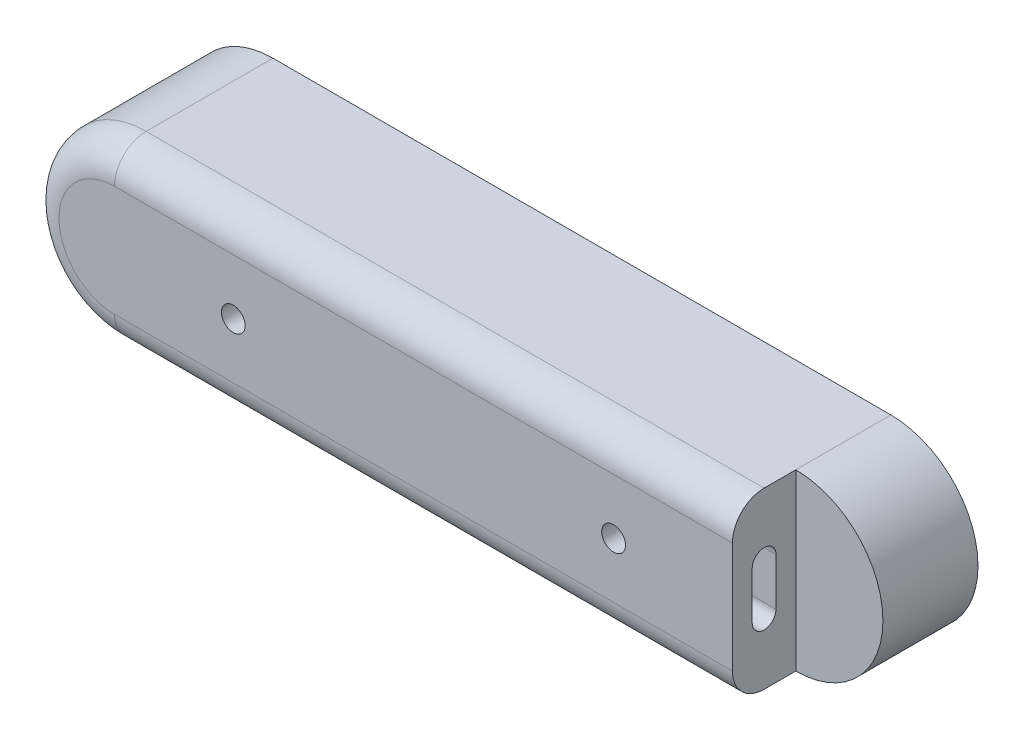
ISO-10303-21;
HEADER;
FILE_DESCRIPTION(('STEP AP214'),'2;1');
FILE_NAME('part.step','',(''),(''),'','','');
FILE_SCHEMA(('AUTOMOTIVE_DESIGN { 1 0 10303 214 1 1 1 1 }'));
ENDSEC;
DATA;
#1=APPLICATION_CONTEXT('core data for automotive mechanical design processes');
#2=APPLICATION_PROTOCOL_DEFINITION('international standard','automotive_design',2000,#1);
#3=PRODUCT_CONTEXT('',#1,'mechanical');
#4=PRODUCT('Part','Part','',(#3));
#5=PRODUCT_RELATED_PRODUCT_CATEGORY('part','',(#4));
#6=PRODUCT_DEFINITION_FORMATION('','',#4);
#7=PRODUCT_DEFINITION_CONTEXT('part definition',#1,'design');
#8=PRODUCT_DEFINITION('design','',#6,#7);
#9=PRODUCT_DEFINITION_SHAPE('','',#8);
#10=(LENGTH_UNIT() NAMED_UNIT(*) SI_UNIT(.MILLI.,.METRE.));
#11=(NAMED_UNIT(*) PLANE_ANGLE_UNIT() SI_UNIT($,.RADIAN.));
#12=(NAMED_UNIT(*) SI_UNIT($,.STERADIAN.) SOLID_ANGLE_UNIT());
#13=UNCERTAINTY_MEASURE_WITH_UNIT(LENGTH_MEASURE(1.E-05),#10,'distance_accuracy_value','');
#14=(GEOMETRIC_REPRESENTATION_CONTEXT(3) GLOBAL_UNCERTAINTY_ASSIGNED_CONTEXT((#13)) GLOBAL_UNIT_ASSIGNED_CONTEXT((#10,
#11,#12)) REPRESENTATION_CONTEXT('',''));
#15=CARTESIAN_POINT('',(0.,0.,0.));
#16=DIRECTION('',(0.,0.,1.));
#17=DIRECTION('',(1.,0.,0.));
#18=AXIS2_PLACEMENT_3D('',#15,#16,#17);
#19=CARTESIAN_POINT('',(0.,0.,20.));
#20=DIRECTION('',(0.,0.,1.));
#21=DIRECTION('',(1.,0.,0.));
#22=AXIS2_PLACEMENT_3D('',#19,#20,#21);
#23=PLANE('',#22);
#24=CARTESIAN_POINT('',(24.,0.,20.));
#25=DIRECTION('',(0.,0.,-1.));
#26=DIRECTION('',(-1.,0.,0.));
#27=AXIS2_PLACEMENT_3D('',#24,#25,#26);
#28=CIRCLE('',#27,1.5);
#29=CARTESIAN_POINT('',(22.5,0.,20.));
#30=VERTEX_POINT('',#29);
#31=EDGE_CURVE('E221',#30,#30,#28,.T.);
#32=ORIENTED_EDGE('',*,*,#31,.T.);
#33=EDGE_LOOP('',(#32));
#34=FACE_BOUND('',#33,.T.);
#35=CARTESIAN_POINT('',(-39.,0.,20.));
#36=DIRECTION('',(0.,0.,1.));
#37=DIRECTION('',(1.,0.,0.));
#38=AXIS2_PLACEMENT_3D('',#35,#36,#37);
#39=CIRCLE('',#38,7.);
#40=CARTESIAN_POINT('',(-39.,7.,20.));
#41=VERTEX_POINT('',#40);
#42=CARTESIAN_POINT('',(-39.,-7.,20.));
#43=VERTEX_POINT('',#42);
#44=EDGE_CURVE('E197',#41,#43,#39,.T.);
#45=ORIENTED_EDGE('',*,*,#44,.T.);
#46=DIRECTION('',(1.,0.,0.));
#47=VECTOR('',#46,1.);
#48=CARTESIAN_POINT('',(39.,-7.,20.));
#49=LINE('',#48,#47);
#50=CARTESIAN_POINT('',(39.0000000000001,-7.,20.));
#51=VERTEX_POINT('',#50);
#52=EDGE_CURVE('E200',#43,#51,#49,.T.);
#53=ORIENTED_EDGE('',*,*,#52,.T.);
#54=DIRECTION('',(0.,-1.,0.));
#55=VECTOR('',#54,1.);
#56=CARTESIAN_POINT('',(39.,2.829176287184E-13,20.));
#57=LINE('',#56,#55);
#58=CARTESIAN_POINT('',(39.,7.,20.));
#59=VERTEX_POINT('',#58);
#60=EDGE_CURVE('E165',#59,#51,#57,.T.);
#61=ORIENTED_EDGE('',*,*,#60,.F.);
#62=DIRECTION('',(-1.,0.,0.));
#63=VECTOR('',#62,1.);
#64=CARTESIAN_POINT('',(-39.,7.,20.));
#65=LINE('',#64,#63);
#66=EDGE_CURVE('E195',#59,#41,#65,.T.);
#67=ORIENTED_EDGE('',*,*,#66,.T.);
#68=EDGE_LOOP('',(#45,#53,#61,#67));
#69=FACE_BOUND('',#68,.T.);
#70=CARTESIAN_POINT('',(-24.,0.,20.));
#71=DIRECTION('',(0.,0.,1.));
#72=DIRECTION('',(1.,0.,0.));
#73=AXIS2_PLACEMENT_3D('',#70,#71,#72);
#74=CIRCLE('',#73,1.5);
#75=CARTESIAN_POINT('',(-22.5,0.,20.));
#76=VERTEX_POINT('',#75);
#77=EDGE_CURVE('E216',#76,#76,#74,.T.);
#78=ORIENTED_EDGE('',*,*,#77,.F.);
#79=EDGE_LOOP('',(#78));
#80=FACE_BOUND('',#79,.T.);
#81=ADVANCED_FACE('F42',(#34,#69,#80),#23,.T.);
#82=CARTESIAN_POINT('',(32.,2.4990531529678E-13,0.));
#83=DIRECTION('',(1.,0.,0.));
#84=DIRECTION('',(0.,1.,0.));
#85=AXIS2_PLACEMENT_3D('',#82,#83,#84);
#86=PLANE('',#85);
#87=DIRECTION('',(0.,-1.,0.));
#88=VECTOR('',#87,1.);
#89=CARTESIAN_POINT('',(32.,4.50000000000023,17.5));
#90=LINE('',#89,#88);
#91=CARTESIAN_POINT('',(32.,3.00000000000023,17.5));
#92=VERTEX_POINT('',#91);
#93=CARTESIAN_POINT('',(32.0000000000001,-2.99999999999977,17.5));
#94=VERTEX_POINT('',#93);
#95=EDGE_CURVE('E153',#92,#94,#90,.T.);
#96=ORIENTED_EDGE('',*,*,#95,.T.);
#97=CARTESIAN_POINT('',(32.0000000000001,-2.99999999999977,16.));
#98=DIRECTION('',(1.,0.,0.));
#99=DIRECTION('',(0.,1.,0.));
#100=AXIS2_PLACEMENT_3D('',#97,#98,#99);
#101=CIRCLE('',#100,1.5);
#102=CARTESIAN_POINT('',(32.0000000000001,-2.99999999999977,14.5));
#103=VERTEX_POINT('',#102);
#104=EDGE_CURVE('E137',#103,#94,#101,.F.);
#105=ORIENTED_EDGE('',*,*,#104,.F.);
#106=DIRECTION('',(0.,1.,0.));
#107=VECTOR('',#106,1.);
#108=CARTESIAN_POINT('',(32.,4.50000000000023,14.5));
#109=LINE('',#108,#107);
#110=CARTESIAN_POINT('',(32.,3.00000000000023,14.5));
#111=VERTEX_POINT('',#110);
#112=EDGE_CURVE('E145',#103,#111,#109,.T.);
#113=ORIENTED_EDGE('',*,*,#112,.T.);
#114=CARTESIAN_POINT('',(32.,3.00000000000023,16.));
#115=DIRECTION('',(1.,0.,0.));
#116=DIRECTION('',(0.,1.,0.));
#117=AXIS2_PLACEMENT_3D('',#114,#115,#116);
#118=CIRCLE('',#117,1.5);
#119=EDGE_CURVE('E236',#111,#92,#118,.T.);
#120=ORIENTED_EDGE('',*,*,#119,.T.);
#121=EDGE_LOOP('',(#96,#105,#113,#120));
#122=FACE_BOUND('',#121,.T.);
#123=ADVANCED_FACE('F242',(#122),#86,.T.);
#124=CARTESIAN_POINT('',(32.,4.50000000000023,14.5));
#125=DIRECTION('',(0.,0.,-1.));
#126=DIRECTION('',(-1.,0.,0.));
#127=AXIS2_PLACEMENT_3D('',#124,#125,#126);
#128=PLANE('',#127);
#129=DIRECTION('',(-1.,0.,0.));
#130=VECTOR('',#129,1.);
#131=CARTESIAN_POINT('',(39.0000000000001,-2.99999999999972,14.5));
#132=LINE('',#131,#130);
#133=CARTESIAN_POINT('',(39.0000000000001,-2.99999999999972,14.5));
#134=VERTEX_POINT('',#133);
#135=EDGE_CURVE('E129',#134,#103,#132,.T.);
#136=ORIENTED_EDGE('',*,*,#135,.F.);
#137=DIRECTION('',(0.,1.,0.));
#138=VECTOR('',#137,1.);
#139=CARTESIAN_POINT('',(39.,4.50000000000028,14.5));
#140=LINE('',#139,#138);
#141=CARTESIAN_POINT('',(39.,3.00000000000028,14.5));
#142=VERTEX_POINT('',#141);
#143=EDGE_CURVE('E143',#134,#142,#140,.T.);
#144=ORIENTED_EDGE('',*,*,#143,.T.);
#145=DIRECTION('',(-1.,0.,0.));
#146=VECTOR('',#145,1.);
#147=CARTESIAN_POINT('',(39.,3.00000000000028,14.5));
#148=LINE('',#147,#146);
#149=EDGE_CURVE('E146',#142,#111,#148,.T.);
#150=ORIENTED_EDGE('',*,*,#149,.T.);
#151=ORIENTED_EDGE('',*,*,#112,.F.);
#152=EDGE_LOOP('',(#136,#144,#150,#151));
#153=FACE_BOUND('',#152,.T.);
#154=ADVANCED_FACE('F141',(#153),#128,.F.);
#155=CARTESIAN_POINT('',(39.,0.,0.));
#156=DIRECTION('',(0.,0.,1.));
#157=DIRECTION('',(1.,0.,0.));
#158=AXIS2_PLACEMENT_3D('',#155,#156,#157);
#159=CYLINDRICAL_SURFACE('',#158,11.);
#160=CARTESIAN_POINT('',(39.,0.,12.));
#161=DIRECTION('',(0.,0.,1.));
#162=DIRECTION('',(1.,0.,0.));
#163=AXIS2_PLACEMENT_3D('',#160,#161,#162);
#164=CIRCLE('',#163,11.);
#165=CARTESIAN_POINT('',(39.,-11.,12.));
#166=VERTEX_POINT('',#165);
#167=CARTESIAN_POINT('',(39.,11.,12.));
#168=VERTEX_POINT('',#167);
#169=EDGE_CURVE('E162',#166,#168,#164,.T.);
#170=ORIENTED_EDGE('',*,*,#169,.F.);
#171=DIRECTION('',(0.,0.,1.));
#172=VECTOR('',#171,1.);
#173=CARTESIAN_POINT('',(39.,-11.,0.));
#174=LINE('',#173,#172);
#175=CARTESIAN_POINT('',(39.,-11.,0.));
#176=VERTEX_POINT('',#175);
#177=EDGE_CURVE('E173',#176,#166,#174,.T.);
#178=ORIENTED_EDGE('',*,*,#177,.F.);
#179=CARTESIAN_POINT('',(39.,0.,0.));
#180=DIRECTION('',(0.,0.,1.));
#181=DIRECTION('',(1.,0.,0.));
#182=AXIS2_PLACEMENT_3D('',#179,#180,#181);
#183=CIRCLE('',#182,11.);
#184=CARTESIAN_POINT('',(39.,11.,0.));
#185=VERTEX_POINT('',#184);
#186=EDGE_CURVE('E178',#185,#176,#183,.F.);
#187=ORIENTED_EDGE('',*,*,#186,.F.);
#188=DIRECTION('',(0.,0.,1.));
#189=VECTOR('',#188,1.);
#190=CARTESIAN_POINT('',(39.,11.,0.));
#191=LINE('',#190,#189);
#192=EDGE_CURVE('E184',#185,#168,#191,.T.);
#193=ORIENTED_EDGE('',*,*,#192,.T.);
#194=EDGE_LOOP('',(#170,#178,#187,#193));
#195=FACE_BOUND('',#194,.T.);
#196=ADVANCED_FACE('F269',(#195),#159,.T.);
#197=CARTESIAN_POINT('',(0.,0.,0.));
#198=DIRECTION('',(0.,0.,1.));
#199=DIRECTION('',(1.,0.,0.));
#200=AXIS2_PLACEMENT_3D('',#197,#198,#199);
#201=PLANE('',#200);
#202=DIRECTION('',(1.,0.,0.));
#203=VECTOR('',#202,1.);
#204=CARTESIAN_POINT('',(-50.,-11.,0.));
#205=LINE('',#204,#203);
#206=CARTESIAN_POINT('',(-39.,-11.,0.));
#207=VERTEX_POINT('',#206);
#208=EDGE_CURVE('E186',#207,#176,#205,.T.);
#209=ORIENTED_EDGE('',*,*,#208,.F.);
#210=CARTESIAN_POINT('',(-39.,0.,0.));
#211=DIRECTION('',(0.,0.,1.));
#212=DIRECTION('',(1.,0.,0.));
#213=AXIS2_PLACEMENT_3D('',#210,#211,#212);
#214=CIRCLE('',#213,11.);
#215=CARTESIAN_POINT('',(-39.,11.,0.));
#216=VERTEX_POINT('',#215);
#217=EDGE_CURVE('E181',#216,#207,#214,.T.);
#218=ORIENTED_EDGE('',*,*,#217,.F.);
#219=DIRECTION('',(-1.,0.,0.));
#220=VECTOR('',#219,1.);
#221=CARTESIAN_POINT('',(-50.,11.,0.));
#222=LINE('',#221,#220);
#223=EDGE_CURVE('E192',#185,#216,#222,.T.);
#224=ORIENTED_EDGE('',*,*,#223,.F.);
#225=ORIENTED_EDGE('',*,*,#186,.T.);
#226=EDGE_LOOP('',(#209,#218,#224,#225));
#227=FACE_BOUND('',#226,.T.);
#228=ADVANCED_FACE('F271',(#227),#201,.F.);
#229=CARTESIAN_POINT('',(-50.,-11.,20.));
#230=DIRECTION('',(0.,1.,0.));
#231=DIRECTION('',(0.,0.,1.));
#232=AXIS2_PLACEMENT_3D('',#229,#230,#231);
#233=PLANE('',#232);
#234=CARTESIAN_POINT('',(0.,-11.,8.00000000000489));
#235=DIRECTION('',(0.,-1.,0.));
#236=DIRECTION('',(0.,0.,-1.));
#237=AXIS2_PLACEMENT_3D('',#234,#235,#236);
#238=CIRCLE('',#237,4.);
#239=CARTESIAN_POINT('',(0.,-11.,4.00000000000489));
#240=VERTEX_POINT('',#239);
#241=EDGE_CURVE('E224',#240,#240,#238,.T.);
#242=ORIENTED_EDGE('',*,*,#241,.F.);
#243=EDGE_LOOP('',(#242));
#244=FACE_BOUND('',#243,.T.);
#245=DIRECTION('',(0.,0.,1.));
#246=VECTOR('',#245,1.);
#247=CARTESIAN_POINT('',(39.,-11.,12.));
#248=LINE('',#247,#246);
#249=CARTESIAN_POINT('',(39.,-11.,16.));
#250=VERTEX_POINT('',#249);
#251=EDGE_CURVE('E170',#166,#250,#248,.T.);
#252=ORIENTED_EDGE('',*,*,#251,.T.);
#253=DIRECTION('',(1.,0.,0.));
#254=VECTOR('',#253,1.);
#255=CARTESIAN_POINT('',(-39.,-11.,16.));
#256=LINE('',#255,#254);
#257=CARTESIAN_POINT('',(-39.,-11.,16.));
#258=VERTEX_POINT('',#257);
#259=EDGE_CURVE('E51',#250,#258,#256,.F.);
#260=ORIENTED_EDGE('',*,*,#259,.T.);
#261=DIRECTION('',(0.,0.,1.));
#262=VECTOR('',#261,1.);
#263=CARTESIAN_POINT('',(-39.,-11.,0.));
#264=LINE('',#263,#262);
#265=EDGE_CURVE('E175',#207,#258,#264,.T.);
#266=ORIENTED_EDGE('',*,*,#265,.F.);
#267=ORIENTED_EDGE('',*,*,#208,.T.);
#268=ORIENTED_EDGE('',*,*,#177,.T.);
#269=EDGE_LOOP('',(#252,#260,#266,#267,#268));
#270=FACE_BOUND('',#269,.T.);
#271=ADVANCED_FACE('F274',(#244,#270),#233,.F.);
#272=CARTESIAN_POINT('',(-50.,11.,20.));
#273=DIRECTION('',(0.,-1.,0.));
#274=DIRECTION('',(0.,0.,-1.));
#275=AXIS2_PLACEMENT_3D('',#272,#273,#274);
#276=PLANE('',#275);
#277=DIRECTION('',(0.,0.,1.));
#278=VECTOR('',#277,1.);
#279=CARTESIAN_POINT('',(-39.,11.,0.));
#280=LINE('',#279,#278);
#281=CARTESIAN_POINT('',(-39.,11.,16.));
#282=VERTEX_POINT('',#281);
#283=EDGE_CURVE('E183',#216,#282,#280,.T.);
#284=ORIENTED_EDGE('',*,*,#283,.T.);
#285=DIRECTION('',(-1.,0.,0.));
#286=VECTOR('',#285,1.);
#287=CARTESIAN_POINT('',(39.,11.,16.));
#288=LINE('',#287,#286);
#289=CARTESIAN_POINT('',(39.,11.,16.));
#290=VERTEX_POINT('',#289);
#291=EDGE_CURVE('E11',#282,#290,#288,.F.);
#292=ORIENTED_EDGE('',*,*,#291,.T.);
#293=DIRECTION('',(0.,0.,1.));
#294=VECTOR('',#293,1.);
#295=CARTESIAN_POINT('',(39.,11.,12.));
#296=LINE('',#295,#294);
#297=EDGE_CURVE('E167',#168,#290,#296,.T.);
#298=ORIENTED_EDGE('',*,*,#297,.F.);
#299=ORIENTED_EDGE('',*,*,#192,.F.);
#300=ORIENTED_EDGE('',*,*,#223,.T.);
#301=EDGE_LOOP('',(#284,#292,#298,#299,#300));
#302=FACE_BOUND('',#301,.T.);
#303=ADVANCED_FACE('F276',(#302),#276,.F.);
#304=CARTESIAN_POINT('',(-39.,0.,0.));
#305=DIRECTION('',(0.,0.,1.));
#306=DIRECTION('',(1.,0.,0.));
#307=AXIS2_PLACEMENT_3D('',#304,#305,#306);
#308=CYLINDRICAL_SURFACE('',#307,11.);
#309=ORIENTED_EDGE('',*,*,#265,.T.);
#310=CARTESIAN_POINT('',(-39.,0.,16.));
#311=DIRECTION('',(0.,0.,1.));
#312=DIRECTION('',(1.,0.,0.));
#313=AXIS2_PLACEMENT_3D('',#310,#311,#312);
#314=CIRCLE('',#313,11.);
#315=EDGE_CURVE('E202',#258,#282,#314,.F.);
#316=ORIENTED_EDGE('',*,*,#315,.T.);
#317=ORIENTED_EDGE('',*,*,#283,.F.);
#318=ORIENTED_EDGE('',*,*,#217,.T.);
#319=EDGE_LOOP('',(#309,#316,#317,#318));
#320=FACE_BOUND('',#319,.T.);
#321=ADVANCED_FACE('F279',(#320),#308,.T.);
#322=CARTESIAN_POINT('',(39.,2.829176287184E-13,12.));
#323=DIRECTION('',(-1.,0.,0.));
#324=DIRECTION('',(0.,-1.,0.));
#325=AXIS2_PLACEMENT_3D('',#322,#323,#324);
#326=PLANE('',#325);
#327=ORIENTED_EDGE('',*,*,#143,.F.);
#328=CARTESIAN_POINT('',(39.0000000000001,-2.99999999999972,16.));
#329=DIRECTION('',(1.,0.,0.));
#330=DIRECTION('',(0.,1.,0.));
#331=AXIS2_PLACEMENT_3D('',#328,#329,#330);
#332=CIRCLE('',#331,1.5);
#333=CARTESIAN_POINT('',(39.0000000000001,-2.99999999999972,17.5));
#334=VERTEX_POINT('',#333);
#335=EDGE_CURVE('E126',#134,#334,#332,.F.);
#336=ORIENTED_EDGE('',*,*,#335,.T.);
#337=DIRECTION('',(0.,-1.,0.));
#338=VECTOR('',#337,1.);
#339=CARTESIAN_POINT('',(39.,4.50000000000028,17.5));
#340=LINE('',#339,#338);
#341=CARTESIAN_POINT('',(39.,3.00000000000028,17.5));
#342=VERTEX_POINT('',#341);
#343=EDGE_CURVE('E154',#342,#334,#340,.T.);
#344=ORIENTED_EDGE('',*,*,#343,.F.);
#345=CARTESIAN_POINT('',(39.,3.00000000000028,16.));
#346=DIRECTION('',(1.,0.,0.));
#347=DIRECTION('',(0.,1.,0.));
#348=AXIS2_PLACEMENT_3D('',#345,#346,#347);
#349=CIRCLE('',#348,1.5);
#350=EDGE_CURVE('E151',#142,#342,#349,.T.);
#351=ORIENTED_EDGE('',*,*,#350,.F.);
#352=EDGE_LOOP('',(#327,#336,#344,#351));
#353=FACE_BOUND('',#352,.T.);
#354=ORIENTED_EDGE('',*,*,#60,.T.);
#355=CARTESIAN_POINT('',(39.0000000000001,-7.,16.));
#356=DIRECTION('',(-1.,0.,0.));
#357=DIRECTION('',(0.,-1.,0.));
#358=AXIS2_PLACEMENT_3D('',#355,#356,#357);
#359=CIRCLE('',#358,4.);
#360=EDGE_CURVE('E206',#51,#250,#359,.F.);
#361=ORIENTED_EDGE('',*,*,#360,.T.);
#362=ORIENTED_EDGE('',*,*,#251,.F.);
#363=DIRECTION('',(0.,-1.,0.));
#364=VECTOR('',#363,1.);
#365=CARTESIAN_POINT('',(39.,2.829176287184E-13,12.));
#366=LINE('',#365,#364);
#367=EDGE_CURVE('E164',#168,#166,#366,.T.);
#368=ORIENTED_EDGE('',*,*,#367,.F.);
#369=ORIENTED_EDGE('',*,*,#297,.T.);
#370=CARTESIAN_POINT('',(39.,7.,16.));
#371=DIRECTION('',(-1.,0.,0.));
#372=DIRECTION('',(0.,-1.,0.));
#373=AXIS2_PLACEMENT_3D('',#370,#371,#372);
#374=CIRCLE('',#373,4.);
#375=EDGE_CURVE('E204',#290,#59,#374,.F.);
#376=ORIENTED_EDGE('',*,*,#375,.T.);
#377=EDGE_LOOP('',(#354,#361,#362,#368,#369,#376));
#378=FACE_BOUND('',#377,.T.);
#379=ADVANCED_FACE('F148',(#353,#378),#326,.F.);
#380=CARTESIAN_POINT('',(0.,0.,12.));
#381=DIRECTION('',(0.,0.,1.));
#382=DIRECTION('',(1.,0.,0.));
#383=AXIS2_PLACEMENT_3D('',#380,#381,#382);
#384=PLANE('',#383);
#385=ORIENTED_EDGE('',*,*,#169,.T.);
#386=ORIENTED_EDGE('',*,*,#367,.T.);
#387=EDGE_LOOP('',(#385,#386));
#388=FACE_BOUND('',#387,.T.);
#389=ADVANCED_FACE('F249',(#388),#384,.T.);
#390=CARTESIAN_POINT('',(32.,4.50000000000023,17.5));
#391=DIRECTION('',(0.,0.,1.));
#392=DIRECTION('',(1.,0.,0.));
#393=AXIS2_PLACEMENT_3D('',#390,#391,#392);
#394=PLANE('',#393);
#395=ORIENTED_EDGE('',*,*,#343,.T.);
#396=DIRECTION('',(-1.,0.,0.));
#397=VECTOR('',#396,1.);
#398=CARTESIAN_POINT('',(39.0000000000001,-2.99999999999972,17.5));
#399=LINE('',#398,#397);
#400=EDGE_CURVE('E132',#334,#94,#399,.T.);
#401=ORIENTED_EDGE('',*,*,#400,.T.);
#402=ORIENTED_EDGE('',*,*,#95,.F.);
#403=DIRECTION('',(-1.,0.,0.));
#404=VECTOR('',#403,1.);
#405=CARTESIAN_POINT('',(39.,3.00000000000028,17.5));
#406=LINE('',#405,#404);
#407=EDGE_CURVE('E158',#342,#92,#406,.T.);
#408=ORIENTED_EDGE('',*,*,#407,.F.);
#409=EDGE_LOOP('',(#395,#401,#402,#408));
#410=FACE_BOUND('',#409,.T.);
#411=ADVANCED_FACE('F247',(#410),#394,.F.);
#412=CARTESIAN_POINT('',(39.,3.00000000000028,16.));
#413=DIRECTION('',(-1.,0.,0.));
#414=DIRECTION('',(0.,-1.,0.));
#415=AXIS2_PLACEMENT_3D('',#412,#413,#414);
#416=CYLINDRICAL_SURFACE('',#415,1.5);
#417=ORIENTED_EDGE('',*,*,#119,.F.);
#418=ORIENTED_EDGE('',*,*,#149,.F.);
#419=ORIENTED_EDGE('',*,*,#350,.T.);
#420=ORIENTED_EDGE('',*,*,#407,.T.);
#421=EDGE_LOOP('',(#417,#418,#419,#420));
#422=FACE_BOUND('',#421,.T.);
#423=ADVANCED_FACE('F245',(#422),#416,.F.);
#424=CARTESIAN_POINT('',(39.0000000000001,-2.99999999999972,16.));
#425=DIRECTION('',(-1.,0.,0.));
#426=DIRECTION('',(0.,-1.,0.));
#427=AXIS2_PLACEMENT_3D('',#424,#425,#426);
#428=CYLINDRICAL_SURFACE('',#427,1.5);
#429=ORIENTED_EDGE('',*,*,#104,.T.);
#430=ORIENTED_EDGE('',*,*,#400,.F.);
#431=ORIENTED_EDGE('',*,*,#335,.F.);
#432=ORIENTED_EDGE('',*,*,#135,.T.);
#433=EDGE_LOOP('',(#429,#430,#431,#432));
#434=FACE_BOUND('',#433,.T.);
#435=ADVANCED_FACE('F128',(#434),#428,.F.);
#436=CARTESIAN_POINT('',(0.,7.,16.));
#437=DIRECTION('',(1.,0.,0.));
#438=DIRECTION('',(0.,0.,-1.));
#439=AXIS2_PLACEMENT_3D('',#436,#437,#438);
#440=CYLINDRICAL_SURFACE('',#439,4.);
#441=ORIENTED_EDGE('',*,*,#375,.F.);
#442=ORIENTED_EDGE('',*,*,#291,.F.);
#443=CARTESIAN_POINT('',(-39.,7.,16.));
#444=DIRECTION('',(-1.,0.,0.));
#445=DIRECTION('',(0.,0.,1.));
#446=AXIS2_PLACEMENT_3D('',#443,#444,#445);
#447=CIRCLE('',#446,4.);
#448=EDGE_CURVE('E46',#41,#282,#447,.T.);
#449=ORIENTED_EDGE('',*,*,#448,.F.);
#450=ORIENTED_EDGE('',*,*,#66,.F.);
#451=EDGE_LOOP('',(#441,#442,#449,#450));
#452=FACE_BOUND('',#451,.T.);
#453=ADVANCED_FACE('F44',(#452),#440,.T.);
#454=CARTESIAN_POINT('',(0.,-7.,16.));
#455=DIRECTION('',(-1.,0.,0.));
#456=DIRECTION('',(0.,0.,1.));
#457=AXIS2_PLACEMENT_3D('',#454,#455,#456);
#458=CYLINDRICAL_SURFACE('',#457,4.);
#459=ORIENTED_EDGE('',*,*,#360,.F.);
#460=ORIENTED_EDGE('',*,*,#52,.F.);
#461=CARTESIAN_POINT('',(-39.,-7.,16.));
#462=DIRECTION('',(-1.,0.,0.));
#463=DIRECTION('',(0.,0.,1.));
#464=AXIS2_PLACEMENT_3D('',#461,#462,#463);
#465=CIRCLE('',#464,4.);
#466=EDGE_CURVE('E208',#258,#43,#465,.T.);
#467=ORIENTED_EDGE('',*,*,#466,.F.);
#468=ORIENTED_EDGE('',*,*,#259,.F.);
#469=EDGE_LOOP('',(#459,#460,#467,#468));
#470=FACE_BOUND('',#469,.T.);
#471=ADVANCED_FACE('F286',(#470),#458,.T.);
#472=CARTESIAN_POINT('',(-39.,0.,16.));
#473=DIRECTION('',(0.,0.,1.));
#474=DIRECTION('',(1.,0.,0.));
#475=AXIS2_PLACEMENT_3D('',#472,#473,#474);
#476=TOROIDAL_SURFACE('',#475,7.,4.);
#477=ORIENTED_EDGE('',*,*,#448,.T.);
#478=ORIENTED_EDGE('',*,*,#315,.F.);
#479=ORIENTED_EDGE('',*,*,#466,.T.);
#480=ORIENTED_EDGE('',*,*,#44,.F.);
#481=EDGE_LOOP('',(#477,#478,#479,#480));
#482=FACE_BOUND('',#481,.T.);
#483=ADVANCED_FACE('F283',(#482),#476,.T.);
#484=CARTESIAN_POINT('',(24.,0.,15.));
#485=DIRECTION('',(0.,0.,1.));
#486=DIRECTION('',(1.,0.,0.));
#487=AXIS2_PLACEMENT_3D('',#484,#485,#486);
#488=CYLINDRICAL_SURFACE('',#487,1.5);
#489=CARTESIAN_POINT('',(24.,0.,15.));
#490=DIRECTION('',(0.,0.,-1.));
#491=DIRECTION('',(-1.,0.,0.));
#492=AXIS2_PLACEMENT_3D('',#489,#490,#491);
#493=CIRCLE('',#492,1.5);
#494=CARTESIAN_POINT('',(22.5,0.,15.));
#495=VERTEX_POINT('',#494);
#496=EDGE_CURVE('E229',#495,#495,#493,.T.);
#497=ORIENTED_EDGE('',*,*,#496,.T.);
#498=EDGE_LOOP('',(#497));
#499=FACE_BOUND('',#498,.T.);
#500=ORIENTED_EDGE('',*,*,#31,.F.);
#501=EDGE_LOOP('',(#500));
#502=FACE_BOUND('',#501,.T.);
#503=ADVANCED_FACE('F285',(#499,#502),#488,.F.);
#504=CARTESIAN_POINT('',(24.,0.,15.));
#505=DIRECTION('',(0.,0.,-1.));
#506=DIRECTION('',(-1.,0.,0.));
#507=AXIS2_PLACEMENT_3D('',#504,#505,#506);
#508=PLANE('',#507);
#509=ORIENTED_EDGE('',*,*,#496,.F.);
#510=EDGE_LOOP('',(#509));
#511=FACE_BOUND('',#510,.T.);
#512=ADVANCED_FACE('F314',(#511),#508,.F.);
#513=CARTESIAN_POINT('',(-24.,0.,15.));
#514=DIRECTION('',(0.,0.,1.));
#515=DIRECTION('',(1.,0.,0.));
#516=AXIS2_PLACEMENT_3D('',#513,#514,#515);
#517=CYLINDRICAL_SURFACE('',#516,1.5);
#518=CARTESIAN_POINT('',(-24.,0.,15.));
#519=DIRECTION('',(0.,0.,1.));
#520=DIRECTION('',(1.,0.,0.));
#521=AXIS2_PLACEMENT_3D('',#518,#519,#520);
#522=CIRCLE('',#521,1.5);
#523=CARTESIAN_POINT('',(-22.5,0.,15.));
#524=VERTEX_POINT('',#523);
#525=EDGE_CURVE('E209',#524,#524,#522,.T.);
#526=ORIENTED_EDGE('',*,*,#525,.F.);
#527=EDGE_LOOP('',(#526));
#528=FACE_BOUND('',#527,.T.);
#529=ORIENTED_EDGE('',*,*,#77,.T.);
#530=EDGE_LOOP('',(#529));
#531=FACE_BOUND('',#530,.T.);
#532=ADVANCED_FACE('F311',(#528,#531),#517,.F.);
#533=CARTESIAN_POINT('',(-24.,0.,15.));
#534=DIRECTION('',(0.,0.,1.));
#535=DIRECTION('',(1.,0.,0.));
#536=AXIS2_PLACEMENT_3D('',#533,#534,#535);
#537=PLANE('',#536);
#538=ORIENTED_EDGE('',*,*,#525,.T.);
#539=EDGE_LOOP('',(#538));
#540=FACE_BOUND('',#539,.T.);
#541=ADVANCED_FACE('F313',(#540),#537,.T.);
#542=CARTESIAN_POINT('',(0.,-0.999999999999999,8.00000000000489));
#543=DIRECTION('',(0.,-1.,0.));
#544=DIRECTION('',(0.,0.,-1.));
#545=AXIS2_PLACEMENT_3D('',#542,#543,#544);
#546=CYLINDRICAL_SURFACE('',#545,4.);
#547=CARTESIAN_POINT('',(0.,-0.999999999999999,8.00000000000489));
#548=DIRECTION('',(0.,-1.,0.));
#549=DIRECTION('',(0.,0.,-1.));
#550=AXIS2_PLACEMENT_3D('',#547,#548,#549);
#551=CIRCLE('',#550,4.);
#552=CARTESIAN_POINT('',(0.,-0.999999999999999,4.00000000000489));
#553=VERTEX_POINT('',#552);
#554=EDGE_CURVE('E232',#553,#553,#551,.T.);
#555=ORIENTED_EDGE('',*,*,#554,.F.);
#556=EDGE_LOOP('',(#555));
#557=FACE_BOUND('',#556,.T.);
#558=ORIENTED_EDGE('',*,*,#241,.T.);
#559=EDGE_LOOP('',(#558));
#560=FACE_BOUND('',#559,.T.);
#561=ADVANCED_FACE('F321',(#557,#560),#546,.F.);
#562=CARTESIAN_POINT('',(0.,-0.999999999999999,8.00000000000489));
#563=DIRECTION('',(0.,-1.,0.));
#564=DIRECTION('',(0.,0.,-1.));
#565=AXIS2_PLACEMENT_3D('',#562,#563,#564);
#566=PLANE('',#565);
#567=ORIENTED_EDGE('',*,*,#554,.T.);
#568=EDGE_LOOP('',(#567));
#569=FACE_BOUND('',#568,.T.);
#570=ADVANCED_FACE('F512',(#569),#566,.T.);
#571=CLOSED_SHELL('',(#81,#123,#154,#196,#228,#271,#303,#321,#379,#389,#411,#423,#435,#453,#471,
#483,#503,#512,#532,#541,#561,#570));
#572=MANIFOLD_SOLID_BREP('B2',#571);
#573=ADVANCED_BREP_SHAPE_REPRESENTATION('',(#18,#572),#14);
#574=SHAPE_DEFINITION_REPRESENTATION(#9,#573);
ENDSEC;
END-ISO-10303-21;
